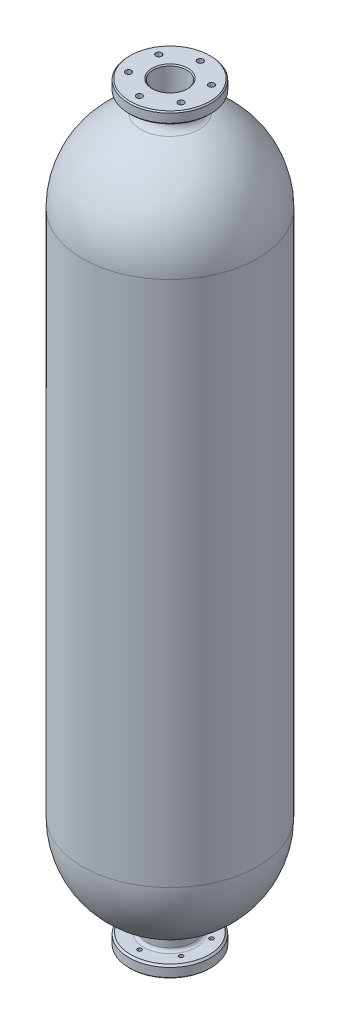
ISO-10303-21;
HEADER;
FILE_DESCRIPTION(('STEP AP214'),'2;1');
FILE_NAME('part.step','',(''),(''),'','','');
FILE_SCHEMA(('AUTOMOTIVE_DESIGN { 1 0 10303 214 1 1 1 1 }'));
ENDSEC;
DATA;
#1=APPLICATION_CONTEXT('core data for automotive mechanical design processes');
#2=APPLICATION_PROTOCOL_DEFINITION('international standard','automotive_design',2000,#1);
#3=PRODUCT_CONTEXT('',#1,'mechanical');
#4=PRODUCT('Part','Part','',(#3));
#5=PRODUCT_RELATED_PRODUCT_CATEGORY('part','',(#4));
#6=PRODUCT_DEFINITION_FORMATION('','',#4);
#7=PRODUCT_DEFINITION_CONTEXT('part definition',#1,'design');
#8=PRODUCT_DEFINITION('design','',#6,#7);
#9=PRODUCT_DEFINITION_SHAPE('','',#8);
#10=(LENGTH_UNIT() NAMED_UNIT(*) SI_UNIT(.MILLI.,.METRE.));
#11=(NAMED_UNIT(*) PLANE_ANGLE_UNIT() SI_UNIT($,.RADIAN.));
#12=(NAMED_UNIT(*) SI_UNIT($,.STERADIAN.) SOLID_ANGLE_UNIT());
#13=UNCERTAINTY_MEASURE_WITH_UNIT(LENGTH_MEASURE(1.E-05),#10,'distance_accuracy_value','');
#14=(GEOMETRIC_REPRESENTATION_CONTEXT(3) GLOBAL_UNCERTAINTY_ASSIGNED_CONTEXT((#13)) GLOBAL_UNIT_ASSIGNED_CONTEXT((#10,
#11,#12)) REPRESENTATION_CONTEXT('',''));
#15=CARTESIAN_POINT('',(0.,0.,0.));
#16=DIRECTION('',(0.,0.,1.));
#17=DIRECTION('',(1.,0.,0.));
#18=AXIS2_PLACEMENT_3D('',#15,#16,#17);
#19=CARTESIAN_POINT('',(0.,-450.5,0.));
#20=DIRECTION('',(0.,1.,0.));
#21=DIRECTION('',(-1.,0.,0.));
#22=AXIS2_PLACEMENT_3D('',#19,#20,#21);
#23=SPHERICAL_SURFACE('',#22,142.);
#24=CARTESIAN_POINT('',(0.,-589.571650833338,0.));
#25=DIRECTION('',(0.,1.,0.));
#26=DIRECTION('',(0.,0.,1.));
#27=AXIS2_PLACEMENT_3D('',#24,#25,#26);
#28=CIRCLE('',#27,28.6892999999999);
#29=CARTESIAN_POINT('',(0.,-589.571650833338,28.6892999999999));
#30=VERTEX_POINT('',#29);
#31=EDGE_CURVE('E535',#30,#30,#28,.T.);
#32=ORIENTED_EDGE('',*,*,#31,.F.);
#33=EDGE_LOOP('',(#32));
#34=FACE_BOUND('',#33,.T.);
#35=CARTESIAN_POINT('',(0.,-450.5,0.));
#36=DIRECTION('',(0.,1.,0.));
#37=DIRECTION('',(0.,0.,1.));
#38=AXIS2_PLACEMENT_3D('',#35,#36,#37);
#39=CIRCLE('',#38,142.);
#40=CARTESIAN_POINT('',(0.,-450.5,142.));
#41=VERTEX_POINT('',#40);
#42=EDGE_CURVE('E111',#41,#41,#39,.T.);
#43=ORIENTED_EDGE('',*,*,#42,.T.);
#44=EDGE_LOOP('',(#43));
#45=FACE_BOUND('',#44,.T.);
#46=ADVANCED_FACE('F53',(#34,#45),#23,.F.);
#47=CARTESIAN_POINT('',(0.,415.469849098758,0.));
#48=DIRECTION('',(0.,1.,0.));
#49=DIRECTION('',(0.,0.,1.));
#50=AXIS2_PLACEMENT_3D('',#47,#48,#49);
#51=CYLINDRICAL_SURFACE('',#50,142.);
#52=CARTESIAN_POINT('',(0.,450.5,0.));
#53=DIRECTION('',(0.,1.,0.));
#54=DIRECTION('',(0.,0.,1.));
#55=AXIS2_PLACEMENT_3D('',#52,#53,#54);
#56=CIRCLE('',#55,142.);
#57=CARTESIAN_POINT('',(0.,450.5,142.));
#58=VERTEX_POINT('',#57);
#59=EDGE_CURVE('E105',#58,#58,#56,.T.);
#60=ORIENTED_EDGE('',*,*,#59,.T.);
#61=EDGE_LOOP('',(#60));
#62=FACE_BOUND('',#61,.T.);
#63=ORIENTED_EDGE('',*,*,#42,.F.);
#64=EDGE_LOOP('',(#63));
#65=FACE_BOUND('',#64,.T.);
#66=ADVANCED_FACE('F330',(#62,#65),#51,.F.);
#67=CARTESIAN_POINT('',(0.,450.5,0.));
#68=DIRECTION('',(0.,1.,0.));
#69=DIRECTION('',(-1.,0.,0.));
#70=AXIS2_PLACEMENT_3D('',#67,#68,#69);
#71=SPHERICAL_SURFACE('',#70,142.);
#72=CARTESIAN_POINT('',(0.,589.571650833338,0.));
#73=DIRECTION('',(0.,-1.,0.));
#74=DIRECTION('',(0.,0.,-1.));
#75=AXIS2_PLACEMENT_3D('',#72,#73,#74);
#76=CIRCLE('',#75,28.6893);
#77=CARTESIAN_POINT('',(0.,589.571650833338,-28.6893));
#78=VERTEX_POINT('',#77);
#79=EDGE_CURVE('E257',#78,#78,#76,.T.);
#80=ORIENTED_EDGE('',*,*,#79,.F.);
#81=EDGE_LOOP('',(#80));
#82=FACE_BOUND('',#81,.T.);
#83=ORIENTED_EDGE('',*,*,#59,.F.);
#84=EDGE_LOOP('',(#83));
#85=FACE_BOUND('',#84,.T.);
#86=ADVANCED_FACE('F338',(#82,#85),#71,.F.);
#87=CARTESIAN_POINT('',(0.,642.5,0.));
#88=DIRECTION('',(0.,1.,0.));
#89=DIRECTION('',(0.,0.,1.));
#90=AXIS2_PLACEMENT_3D('',#87,#88,#89);
#91=CYLINDRICAL_SURFACE('',#90,28.6893);
#92=CARTESIAN_POINT('',(0.,640.6966,0.));
#93=DIRECTION('',(0.,1.,0.));
#94=DIRECTION('',(0.,0.,1.));
#95=AXIS2_PLACEMENT_3D('',#92,#93,#94);
#96=CIRCLE('',#95,28.6893);
#97=CARTESIAN_POINT('',(0.,640.6966,28.6893));
#98=VERTEX_POINT('',#97);
#99=EDGE_CURVE('E253',#98,#98,#96,.T.);
#100=ORIENTED_EDGE('',*,*,#99,.T.);
#101=EDGE_LOOP('',(#100));
#102=FACE_BOUND('',#101,.T.);
#103=ORIENTED_EDGE('',*,*,#79,.T.);
#104=EDGE_LOOP('',(#103));
#105=FACE_BOUND('',#104,.T.);
#106=ADVANCED_FACE('F464',(#102,#105),#91,.F.);
#107=CARTESIAN_POINT('',(0.,642.5,0.));
#108=DIRECTION('',(0.,1.,0.));
#109=DIRECTION('',(0.,0.,1.));
#110=AXIS2_PLACEMENT_3D('',#107,#108,#109);
#111=CONICAL_SURFACE('',#110,30.4927,0.785398163397452);
#112=ORIENTED_EDGE('',*,*,#99,.F.);
#113=EDGE_LOOP('',(#112));
#114=FACE_BOUND('',#113,.T.);
#115=CARTESIAN_POINT('',(0.,642.5,0.));
#116=DIRECTION('',(0.,1.,0.));
#117=DIRECTION('',(0.,0.,1.));
#118=AXIS2_PLACEMENT_3D('',#115,#116,#117);
#119=CIRCLE('',#118,30.4927);
#120=CARTESIAN_POINT('',(0.,642.5,30.4927));
#121=VERTEX_POINT('',#120);
#122=EDGE_CURVE('E75',#121,#121,#119,.T.);
#123=ORIENTED_EDGE('',*,*,#122,.T.);
#124=EDGE_LOOP('',(#123));
#125=FACE_BOUND('',#124,.T.);
#126=ADVANCED_FACE('F385',(#114,#125),#111,.F.);
#127=CARTESIAN_POINT('',(0.,450.5,0.));
#128=DIRECTION('',(0.,1.,0.));
#129=DIRECTION('',(-1.,0.,0.));
#130=AXIS2_PLACEMENT_3D('',#127,#128,#129);
#131=SPHERICAL_SURFACE('',#130,150.);
#132=CARTESIAN_POINT('',(0.,450.5,0.));
#133=DIRECTION('',(0.,1.,0.));
#134=DIRECTION('',(0.,0.,1.));
#135=AXIS2_PLACEMENT_3D('',#132,#133,#134);
#136=CIRCLE('',#135,150.);
#137=CARTESIAN_POINT('',(0.,450.5,150.));
#138=VERTEX_POINT('',#137);
#139=EDGE_CURVE('E11',#138,#138,#136,.T.);
#140=ORIENTED_EDGE('',*,*,#139,.T.);
#141=EDGE_LOOP('',(#140));
#142=FACE_BOUND('',#141,.T.);
#143=CARTESIAN_POINT('',(0.,591.92135623731,0.));
#144=DIRECTION('',(0.,1.,0.));
#145=DIRECTION('',(0.,0.,1.));
#146=AXIS2_PLACEMENT_3D('',#143,#144,#145);
#147=CIRCLE('',#146,50.);
#148=CARTESIAN_POINT('',(0.,591.92135623731,50.));
#149=VERTEX_POINT('',#148);
#150=EDGE_CURVE('E160',#149,#149,#147,.T.);
#151=ORIENTED_EDGE('',*,*,#150,.F.);
#152=EDGE_LOOP('',(#151));
#153=FACE_BOUND('',#152,.T.);
#154=ADVANCED_FACE('F55',(#142,#153),#131,.T.);
#155=CARTESIAN_POINT('',(0.,415.469849098758,0.));
#156=DIRECTION('',(0.,1.,0.));
#157=DIRECTION('',(0.,0.,1.));
#158=AXIS2_PLACEMENT_3D('',#155,#156,#157);
#159=CYLINDRICAL_SURFACE('',#158,150.);
#160=CARTESIAN_POINT('',(0.,-450.5,0.));
#161=DIRECTION('',(0.,1.,0.));
#162=DIRECTION('',(0.,0.,1.));
#163=AXIS2_PLACEMENT_3D('',#160,#161,#162);
#164=CIRCLE('',#163,150.);
#165=CARTESIAN_POINT('',(0.,-450.5,150.));
#166=VERTEX_POINT('',#165);
#167=EDGE_CURVE('E62',#166,#166,#164,.T.);
#168=ORIENTED_EDGE('',*,*,#167,.T.);
#169=EDGE_LOOP('',(#168));
#170=FACE_BOUND('',#169,.T.);
#171=ORIENTED_EDGE('',*,*,#139,.F.);
#172=EDGE_LOOP('',(#171));
#173=FACE_BOUND('',#172,.T.);
#174=ADVANCED_FACE('F378',(#170,#173),#159,.T.);
#175=CARTESIAN_POINT('',(0.,-450.5,0.));
#176=DIRECTION('',(0.,1.,0.));
#177=DIRECTION('',(-1.,0.,0.));
#178=AXIS2_PLACEMENT_3D('',#175,#176,#177);
#179=SPHERICAL_SURFACE('',#178,150.);
#180=CARTESIAN_POINT('',(0.,-591.92135623731,0.));
#181=DIRECTION('',(0.,1.,0.));
#182=DIRECTION('',(0.,0.,1.));
#183=AXIS2_PLACEMENT_3D('',#180,#181,#182);
#184=CIRCLE('',#183,50.);
#185=CARTESIAN_POINT('',(0.,-591.92135623731,50.));
#186=VERTEX_POINT('',#185);
#187=EDGE_CURVE('E149',#186,#186,#184,.T.);
#188=ORIENTED_EDGE('',*,*,#187,.T.);
#189=EDGE_LOOP('',(#188));
#190=FACE_BOUND('',#189,.T.);
#191=ORIENTED_EDGE('',*,*,#167,.F.);
#192=EDGE_LOOP('',(#191));
#193=FACE_BOUND('',#192,.T.);
#194=ADVANCED_FACE('F375',(#190,#193),#179,.T.);
#195=CARTESIAN_POINT('',(0.,-606.063491861041,0.));
#196=DIRECTION('',(0.,1.,0.));
#197=DIRECTION('',(0.,0.,1.));
#198=AXIS2_PLACEMENT_3D('',#195,#196,#197);
#199=TOROIDAL_SURFACE('',#198,55.,15.);
#200=CARTESIAN_POINT('',(0.,-606.06349186104,0.));
#201=DIRECTION('',(0.,1.,0.));
#202=DIRECTION('',(0.,0.,1.));
#203=AXIS2_PLACEMENT_3D('',#200,#201,#202);
#204=CIRCLE('',#203,40.);
#205=CARTESIAN_POINT('',(0.,-606.06349186104,40.));
#206=VERTEX_POINT('',#205);
#207=EDGE_CURVE('E145',#206,#206,#204,.T.);
#208=ORIENTED_EDGE('',*,*,#207,.T.);
#209=EDGE_LOOP('',(#208));
#210=FACE_BOUND('',#209,.T.);
#211=ORIENTED_EDGE('',*,*,#187,.F.);
#212=EDGE_LOOP('',(#211));
#213=FACE_BOUND('',#212,.T.);
#214=ADVANCED_FACE('F371',(#210,#213),#199,.F.);
#215=CARTESIAN_POINT('',(0.,415.469849098758,0.));
#216=DIRECTION('',(0.,1.,0.));
#217=DIRECTION('',(0.,0.,1.));
#218=AXIS2_PLACEMENT_3D('',#215,#216,#217);
#219=CYLINDRICAL_SURFACE('',#218,40.);
#220=CARTESIAN_POINT('',(0.,-617.5,0.));
#221=DIRECTION('',(0.,1.,0.));
#222=DIRECTION('',(0.,0.,1.));
#223=AXIS2_PLACEMENT_3D('',#220,#221,#222);
#224=CIRCLE('',#223,40.);
#225=CARTESIAN_POINT('',(0.,-617.5,40.));
#226=VERTEX_POINT('',#225);
#227=EDGE_CURVE('E141',#226,#226,#224,.T.);
#228=ORIENTED_EDGE('',*,*,#227,.T.);
#229=EDGE_LOOP('',(#228));
#230=FACE_BOUND('',#229,.T.);
#231=ORIENTED_EDGE('',*,*,#207,.F.);
#232=EDGE_LOOP('',(#231));
#233=FACE_BOUND('',#232,.T.);
#234=ADVANCED_FACE('F367',(#230,#233),#219,.T.);
#235=CARTESIAN_POINT('',(0.,-617.5,0.));
#236=DIRECTION('',(0.,1.,0.));
#237=DIRECTION('',(0.,0.,1.));
#238=AXIS2_PLACEMENT_3D('',#235,#236,#237);
#239=TOROIDAL_SURFACE('',#238,45.,5.00000000000006);
#240=CARTESIAN_POINT('',(0.,-622.5,0.));
#241=DIRECTION('',(0.,1.,0.));
#242=DIRECTION('',(0.,0.,1.));
#243=AXIS2_PLACEMENT_3D('',#240,#241,#242);
#244=CIRCLE('',#243,45.);
#245=CARTESIAN_POINT('',(0.,-622.5,45.));
#246=VERTEX_POINT('',#245);
#247=EDGE_CURVE('E137',#246,#246,#244,.T.);
#248=ORIENTED_EDGE('',*,*,#247,.T.);
#249=EDGE_LOOP('',(#248));
#250=FACE_BOUND('',#249,.T.);
#251=ORIENTED_EDGE('',*,*,#227,.F.);
#252=EDGE_LOOP('',(#251));
#253=FACE_BOUND('',#252,.T.);
#254=ADVANCED_FACE('F363',(#250,#253),#239,.F.);
#255=CARTESIAN_POINT('',(-67.,-622.5,0.));
#256=DIRECTION('',(0.,1.,0.));
#257=DIRECTION('',(0.,0.,1.));
#258=AXIS2_PLACEMENT_3D('',#255,#256,#257);
#259=PLANE('',#258);
#260=CARTESIAN_POINT('',(45.0333209967905,-622.5,-26.0000000000005));
#261=DIRECTION('',(0.,1.,0.));
#262=DIRECTION('',(0.,0.,1.));
#263=AXIS2_PLACEMENT_3D('',#260,#261,#262);
#264=CIRCLE('',#263,3.46083449176697);
#265=CARTESIAN_POINT('',(45.0333209967905,-622.5,-22.5391655082336));
#266=VERTEX_POINT('',#265);
#267=EDGE_CURVE('E57',#266,#266,#264,.T.);
#268=ORIENTED_EDGE('',*,*,#267,.F.);
#269=EDGE_LOOP('',(#268));
#270=FACE_BOUND('',#269,.T.);
#271=CARTESIAN_POINT('',(45.033320996791,-622.5,25.9999999999996));
#272=DIRECTION('',(0.,1.,0.));
#273=DIRECTION('',(0.,0.,1.));
#274=AXIS2_PLACEMENT_3D('',#271,#272,#273);
#275=CIRCLE('',#274,3.46083449176697);
#276=CARTESIAN_POINT('',(45.033320996791,-622.5,29.4608344917665));
#277=VERTEX_POINT('',#276);
#278=EDGE_CURVE('E209',#277,#277,#275,.T.);
#279=ORIENTED_EDGE('',*,*,#278,.F.);
#280=EDGE_LOOP('',(#279));
#281=FACE_BOUND('',#280,.T.);
#282=CARTESIAN_POINT('',(0.,-622.5,52.));
#283=DIRECTION('',(0.,1.,0.));
#284=DIRECTION('',(0.,0.,1.));
#285=AXIS2_PLACEMENT_3D('',#282,#283,#284);
#286=CIRCLE('',#285,3.46083449176697);
#287=CARTESIAN_POINT('',(0.,-622.5,55.460834491767));
#288=VERTEX_POINT('',#287);
#289=EDGE_CURVE('E204',#288,#288,#286,.T.);
#290=ORIENTED_EDGE('',*,*,#289,.F.);
#291=EDGE_LOOP('',(#290));
#292=FACE_BOUND('',#291,.T.);
#293=CARTESIAN_POINT('',(-45.0333209967907,-622.5,26.0000000000002));
#294=DIRECTION('',(0.,1.,0.));
#295=DIRECTION('',(0.,0.,1.));
#296=AXIS2_PLACEMENT_3D('',#293,#294,#295);
#297=CIRCLE('',#296,3.46083449176697);
#298=CARTESIAN_POINT('',(-45.0333209967907,-622.5,29.4608344917672));
#299=VERTEX_POINT('',#298);
#300=EDGE_CURVE('E198',#299,#299,#297,.T.);
#301=ORIENTED_EDGE('',*,*,#300,.F.);
#302=EDGE_LOOP('',(#301));
#303=FACE_BOUND('',#302,.T.);
#304=CARTESIAN_POINT('',(-45.0333209967909,-622.5,-25.9999999999999));
#305=DIRECTION('',(0.,1.,0.));
#306=DIRECTION('',(0.,0.,1.));
#307=AXIS2_PLACEMENT_3D('',#304,#305,#306);
#308=CIRCLE('',#307,3.46083449176697);
#309=CARTESIAN_POINT('',(-45.0333209967909,-622.5,-22.5391655082329));
#310=VERTEX_POINT('',#309);
#311=EDGE_CURVE('E192',#310,#310,#308,.T.);
#312=ORIENTED_EDGE('',*,*,#311,.F.);
#313=EDGE_LOOP('',(#312));
#314=FACE_BOUND('',#313,.T.);
#315=CARTESIAN_POINT('',(0.,-622.5,-52.));
#316=DIRECTION('',(0.,1.,0.));
#317=DIRECTION('',(0.,0.,1.));
#318=AXIS2_PLACEMENT_3D('',#315,#316,#317);
#319=CIRCLE('',#318,3.46083449176697);
#320=CARTESIAN_POINT('',(0.,-622.5,-48.539165508233));
#321=VERTEX_POINT('',#320);
#322=EDGE_CURVE('E187',#321,#321,#319,.T.);
#323=ORIENTED_EDGE('',*,*,#322,.F.);
#324=EDGE_LOOP('',(#323));
#325=FACE_BOUND('',#324,.T.);
#326=CARTESIAN_POINT('',(0.,-622.5,0.));
#327=DIRECTION('',(0.,1.,0.));
#328=DIRECTION('',(0.,0.,1.));
#329=AXIS2_PLACEMENT_3D('',#326,#327,#328);
#330=CIRCLE('',#329,67.);
#331=CARTESIAN_POINT('',(0.,-622.5,67.));
#332=VERTEX_POINT('',#331);
#333=EDGE_CURVE('E133',#332,#332,#330,.T.);
#334=ORIENTED_EDGE('',*,*,#333,.T.);
#335=EDGE_LOOP('',(#334));
#336=FACE_BOUND('',#335,.T.);
#337=ORIENTED_EDGE('',*,*,#247,.F.);
#338=EDGE_LOOP('',(#337));
#339=FACE_BOUND('',#338,.T.);
#340=ADVANCED_FACE('F359',(#270,#281,#292,#303,#314,#325,#336,#339),#259,.T.);
#341=CARTESIAN_POINT('',(0.,-622.5,0.));
#342=DIRECTION('',(0.,-1.,0.));
#343=DIRECTION('',(0.,0.,-1.));
#344=AXIS2_PLACEMENT_3D('',#341,#342,#343);
#345=CONICAL_SURFACE('',#344,67.,0.785398163397432);
#346=CARTESIAN_POINT('',(0.,-625.5,0.));
#347=DIRECTION('',(0.,1.,0.));
#348=DIRECTION('',(0.,0.,1.));
#349=AXIS2_PLACEMENT_3D('',#346,#347,#348);
#350=CIRCLE('',#349,70.);
#351=CARTESIAN_POINT('',(0.,-625.5,70.));
#352=VERTEX_POINT('',#351);
#353=EDGE_CURVE('E129',#352,#352,#350,.T.);
#354=ORIENTED_EDGE('',*,*,#353,.T.);
#355=EDGE_LOOP('',(#354));
#356=FACE_BOUND('',#355,.T.);
#357=ORIENTED_EDGE('',*,*,#333,.F.);
#358=EDGE_LOOP('',(#357));
#359=FACE_BOUND('',#358,.T.);
#360=ADVANCED_FACE('F355',(#356,#359),#345,.T.);
#361=CARTESIAN_POINT('',(0.,415.469849098758,0.));
#362=DIRECTION('',(0.,1.,0.));
#363=DIRECTION('',(0.,0.,1.));
#364=AXIS2_PLACEMENT_3D('',#361,#362,#363);
#365=CYLINDRICAL_SURFACE('',#364,70.);
#366=CARTESIAN_POINT('',(0.,-640.5,0.));
#367=DIRECTION('',(0.,1.,0.));
#368=DIRECTION('',(0.,0.,1.));
#369=AXIS2_PLACEMENT_3D('',#366,#367,#368);
#370=CIRCLE('',#369,70.);
#371=CARTESIAN_POINT('',(0.,-640.5,70.));
#372=VERTEX_POINT('',#371);
#373=EDGE_CURVE('E125',#372,#372,#370,.T.);
#374=ORIENTED_EDGE('',*,*,#373,.T.);
#375=EDGE_LOOP('',(#374));
#376=FACE_BOUND('',#375,.T.);
#377=ORIENTED_EDGE('',*,*,#353,.F.);
#378=EDGE_LOOP('',(#377));
#379=FACE_BOUND('',#378,.T.);
#380=ADVANCED_FACE('F351',(#376,#379),#365,.T.);
#381=CARTESIAN_POINT('',(0.,-640.5,0.));
#382=DIRECTION('',(0.,1.,0.));
#383=DIRECTION('',(0.,0.,1.));
#384=AXIS2_PLACEMENT_3D('',#381,#382,#383);
#385=CONICAL_SURFACE('',#384,70.,0.785398163397448);
#386=CARTESIAN_POINT('',(0.,-642.5,0.));
#387=DIRECTION('',(0.,1.,0.));
#388=DIRECTION('',(0.,0.,1.));
#389=AXIS2_PLACEMENT_3D('',#386,#387,#388);
#390=CIRCLE('',#389,68.);
#391=CARTESIAN_POINT('',(0.,-642.5,68.));
#392=VERTEX_POINT('',#391);
#393=EDGE_CURVE('E121',#392,#392,#390,.T.);
#394=ORIENTED_EDGE('',*,*,#393,.T.);
#395=EDGE_LOOP('',(#394));
#396=FACE_BOUND('',#395,.T.);
#397=ORIENTED_EDGE('',*,*,#373,.F.);
#398=EDGE_LOOP('',(#397));
#399=FACE_BOUND('',#398,.T.);
#400=ADVANCED_FACE('F347',(#396,#399),#385,.T.);
#401=CARTESIAN_POINT('',(0.,-642.5,0.));
#402=DIRECTION('',(0.,-1.,0.));
#403=DIRECTION('',(0.,0.,-1.));
#404=AXIS2_PLACEMENT_3D('',#401,#402,#403);
#405=PLANE('',#404);
#406=CARTESIAN_POINT('',(0.,-642.5,0.));
#407=DIRECTION('',(0.,-1.,0.));
#408=DIRECTION('',(0.,0.,-1.));
#409=AXIS2_PLACEMENT_3D('',#406,#407,#408);
#410=CIRCLE('',#409,30.4927);
#411=CARTESIAN_POINT('',(0.,-642.5,-30.4927));
#412=VERTEX_POINT('',#411);
#413=EDGE_CURVE('E531',#412,#412,#410,.T.);
#414=ORIENTED_EDGE('',*,*,#413,.F.);
#415=EDGE_LOOP('',(#414));
#416=FACE_BOUND('',#415,.T.);
#417=CARTESIAN_POINT('',(45.0333209967905,-642.5,-26.0000000000005));
#418=DIRECTION('',(0.,-1.,0.));
#419=DIRECTION('',(0.,0.,-1.));
#420=AXIS2_PLACEMENT_3D('',#417,#418,#419);
#421=CIRCLE('',#420,5.04189999999999);
#422=CARTESIAN_POINT('',(45.0333209967905,-642.5,-31.0419000000005));
#423=VERTEX_POINT('',#422);
#424=EDGE_CURVE('E541',#423,#423,#421,.T.);
#425=ORIENTED_EDGE('',*,*,#424,.F.);
#426=EDGE_LOOP('',(#425));
#427=FACE_BOUND('',#426,.T.);
#428=CARTESIAN_POINT('',(45.033320996791,-642.5,25.9999999999996));
#429=DIRECTION('',(0.,-1.,0.));
#430=DIRECTION('',(0.,0.,-1.));
#431=AXIS2_PLACEMENT_3D('',#428,#429,#430);
#432=CIRCLE('',#431,5.04189999999999);
#433=CARTESIAN_POINT('',(45.033320996791,-642.5,20.9580999999996));
#434=VERTEX_POINT('',#433);
#435=EDGE_CURVE('E221',#434,#434,#432,.T.);
#436=ORIENTED_EDGE('',*,*,#435,.F.);
#437=EDGE_LOOP('',(#436));
#438=FACE_BOUND('',#437,.T.);
#439=CARTESIAN_POINT('',(0.,-642.5,52.));
#440=DIRECTION('',(0.,-1.,0.));
#441=DIRECTION('',(0.,0.,-1.));
#442=AXIS2_PLACEMENT_3D('',#439,#440,#441);
#443=CIRCLE('',#442,5.0419);
#444=CARTESIAN_POINT('',(0.,-642.5,46.9581));
#445=VERTEX_POINT('',#444);
#446=EDGE_CURVE('E212',#445,#445,#443,.T.);
#447=ORIENTED_EDGE('',*,*,#446,.F.);
#448=EDGE_LOOP('',(#447));
#449=FACE_BOUND('',#448,.T.);
#450=CARTESIAN_POINT('',(-45.0333209967907,-642.5,26.0000000000002));
#451=DIRECTION('',(0.,-1.,0.));
#452=DIRECTION('',(0.,0.,-1.));
#453=AXIS2_PLACEMENT_3D('',#450,#451,#452);
#454=CIRCLE('',#453,5.0419);
#455=CARTESIAN_POINT('',(-45.0333209967907,-642.5,20.9581000000002));
#456=VERTEX_POINT('',#455);
#457=EDGE_CURVE('E207',#456,#456,#454,.T.);
#458=ORIENTED_EDGE('',*,*,#457,.F.);
#459=EDGE_LOOP('',(#458));
#460=FACE_BOUND('',#459,.T.);
#461=CARTESIAN_POINT('',(-45.0333209967909,-642.5,-25.9999999999999));
#462=DIRECTION('',(0.,-1.,0.));
#463=DIRECTION('',(0.,0.,-1.));
#464=AXIS2_PLACEMENT_3D('',#461,#462,#463);
#465=CIRCLE('',#464,5.04189999999999);
#466=CARTESIAN_POINT('',(-45.0333209967909,-642.5,-31.0418999999999));
#467=VERTEX_POINT('',#466);
#468=EDGE_CURVE('E202',#467,#467,#465,.T.);
#469=ORIENTED_EDGE('',*,*,#468,.F.);
#470=EDGE_LOOP('',(#469));
#471=FACE_BOUND('',#470,.T.);
#472=CARTESIAN_POINT('',(0.,-642.5,-52.));
#473=DIRECTION('',(0.,-1.,0.));
#474=DIRECTION('',(0.,0.,-1.));
#475=AXIS2_PLACEMENT_3D('',#472,#473,#474);
#476=CIRCLE('',#475,5.0419);
#477=CARTESIAN_POINT('',(0.,-642.5,-57.0419));
#478=VERTEX_POINT('',#477);
#479=EDGE_CURVE('E196',#478,#478,#476,.T.);
#480=ORIENTED_EDGE('',*,*,#479,.F.);
#481=EDGE_LOOP('',(#480));
#482=FACE_BOUND('',#481,.T.);
#483=ORIENTED_EDGE('',*,*,#393,.F.);
#484=EDGE_LOOP('',(#483));
#485=FACE_BOUND('',#484,.T.);
#486=ADVANCED_FACE('F70',(#416,#427,#438,#449,#460,#471,#482,#485),#405,.T.);
#487=CARTESIAN_POINT('',(-40.,642.5,0.));
#488=DIRECTION('',(0.,1.,0.));
#489=DIRECTION('',(0.,0.,1.));
#490=AXIS2_PLACEMENT_3D('',#487,#488,#489);
#491=PLANE('',#490);
#492=CARTESIAN_POINT('',(0.,644.303460289957,59.716398180906));
#493=VERTEX_POINT('',#492);
#494=VERTEX_LOOP('',#493);
#495=FACE_BOUND('',#494,.T.);
#496=ORIENTED_EDGE('',*,*,#122,.F.);
#497=EDGE_LOOP('',(#496));
#498=FACE_BOUND('',#497,.T.);
#499=CARTESIAN_POINT('',(45.0333209967905,642.5,-26.0000000000005));
#500=DIRECTION('',(0.,1.,0.));
#501=DIRECTION('',(0.,0.,1.));
#502=AXIS2_PLACEMENT_3D('',#499,#500,#501);
#503=CIRCLE('',#502,5.04189999999999);
#504=CARTESIAN_POINT('',(45.0333209967905,642.5,-20.9581000000005));
#505=VERTEX_POINT('',#504);
#506=EDGE_CURVE('E79',#505,#505,#503,.T.);
#507=ORIENTED_EDGE('',*,*,#506,.F.);
#508=EDGE_LOOP('',(#507));
#509=FACE_BOUND('',#508,.T.);
#510=CARTESIAN_POINT('',(45.033320996791,642.5,25.9999999999996));
#511=DIRECTION('',(0.,1.,0.));
#512=DIRECTION('',(0.,0.,1.));
#513=AXIS2_PLACEMENT_3D('',#510,#511,#512);
#514=CIRCLE('',#513,5.04189999999999);
#515=CARTESIAN_POINT('',(45.033320996791,642.5,31.0418999999996));
#516=VERTEX_POINT('',#515);
#517=EDGE_CURVE('E83',#516,#516,#514,.T.);
#518=ORIENTED_EDGE('',*,*,#517,.F.);
#519=EDGE_LOOP('',(#518));
#520=FACE_BOUND('',#519,.T.);
#521=CARTESIAN_POINT('',(0.,642.5,52.));
#522=DIRECTION('',(0.,1.,0.));
#523=DIRECTION('',(0.,0.,1.));
#524=AXIS2_PLACEMENT_3D('',#521,#522,#523);
#525=CIRCLE('',#524,5.0419);
#526=CARTESIAN_POINT('',(0.,642.5,57.0419));
#527=VERTEX_POINT('',#526);
#528=EDGE_CURVE('E87',#527,#527,#525,.T.);
#529=ORIENTED_EDGE('',*,*,#528,.F.);
#530=EDGE_LOOP('',(#529));
#531=FACE_BOUND('',#530,.T.);
#532=CARTESIAN_POINT('',(-45.0333209967907,642.5,26.0000000000002));
#533=DIRECTION('',(0.,1.,0.));
#534=DIRECTION('',(0.,0.,1.));
#535=AXIS2_PLACEMENT_3D('',#532,#533,#534);
#536=CIRCLE('',#535,5.0419);
#537=CARTESIAN_POINT('',(-45.0333209967907,642.5,31.0419000000002));
#538=VERTEX_POINT('',#537);
#539=EDGE_CURVE('E91',#538,#538,#536,.T.);
#540=ORIENTED_EDGE('',*,*,#539,.F.);
#541=EDGE_LOOP('',(#540));
#542=FACE_BOUND('',#541,.T.);
#543=CARTESIAN_POINT('',(-45.0333209967909,642.5,-25.9999999999999));
#544=DIRECTION('',(0.,1.,0.));
#545=DIRECTION('',(0.,0.,1.));
#546=AXIS2_PLACEMENT_3D('',#543,#544,#545);
#547=CIRCLE('',#546,5.04189999999999);
#548=CARTESIAN_POINT('',(-45.0333209967909,642.5,-20.9580999999999));
#549=VERTEX_POINT('',#548);
#550=EDGE_CURVE('E95',#549,#549,#547,.T.);
#551=ORIENTED_EDGE('',*,*,#550,.F.);
#552=EDGE_LOOP('',(#551));
#553=FACE_BOUND('',#552,.T.);
#554=CARTESIAN_POINT('',(0.,642.5,-52.));
#555=DIRECTION('',(0.,1.,0.));
#556=DIRECTION('',(0.,0.,1.));
#557=AXIS2_PLACEMENT_3D('',#554,#555,#556);
#558=CIRCLE('',#557,5.0419);
#559=CARTESIAN_POINT('',(0.,642.5,-46.9581));
#560=VERTEX_POINT('',#559);
#561=EDGE_CURVE('E99',#560,#560,#558,.T.);
#562=ORIENTED_EDGE('',*,*,#561,.F.);
#563=EDGE_LOOP('',(#562));
#564=FACE_BOUND('',#563,.T.);
#565=CARTESIAN_POINT('',(0.,642.5,0.));
#566=DIRECTION('',(0.,1.,0.));
#567=DIRECTION('',(0.,0.,1.));
#568=AXIS2_PLACEMENT_3D('',#565,#566,#567);
#569=CIRCLE('',#568,68.);
#570=CARTESIAN_POINT('',(0.,642.5,68.));
#571=VERTEX_POINT('',#570);
#572=EDGE_CURVE('E102',#571,#571,#569,.T.);
#573=ORIENTED_EDGE('',*,*,#572,.T.);
#574=EDGE_LOOP('',(#573));
#575=FACE_BOUND('',#574,.T.);
#576=ADVANCED_FACE('F66',(#495,#498,#509,#520,#531,#542,#553,#564,#575),#491,.T.);
#577=CARTESIAN_POINT('',(0.,642.5,0.));
#578=DIRECTION('',(0.,-1.,0.));
#579=DIRECTION('',(0.,0.,-1.));
#580=AXIS2_PLACEMENT_3D('',#577,#578,#579);
#581=CONICAL_SURFACE('',#580,68.,0.785398163397448);
#582=CARTESIAN_POINT('',(0.,640.5,0.));
#583=DIRECTION('',(0.,1.,0.));
#584=DIRECTION('',(0.,0.,1.));
#585=AXIS2_PLACEMENT_3D('',#582,#583,#584);
#586=CIRCLE('',#585,70.);
#587=CARTESIAN_POINT('',(0.,640.5,70.));
#588=VERTEX_POINT('',#587);
#589=EDGE_CURVE('E106',#588,#588,#586,.T.);
#590=ORIENTED_EDGE('',*,*,#589,.T.);
#591=EDGE_LOOP('',(#590));
#592=FACE_BOUND('',#591,.T.);
#593=ORIENTED_EDGE('',*,*,#572,.F.);
#594=EDGE_LOOP('',(#593));
#595=FACE_BOUND('',#594,.T.);
#596=ADVANCED_FACE('F69',(#592,#595),#581,.T.);
#597=CARTESIAN_POINT('',(0.,415.469849098758,0.));
#598=DIRECTION('',(0.,1.,0.));
#599=DIRECTION('',(0.,0.,1.));
#600=AXIS2_PLACEMENT_3D('',#597,#598,#599);
#601=CYLINDRICAL_SURFACE('',#600,70.);
#602=CARTESIAN_POINT('',(0.,625.5,0.));
#603=DIRECTION('',(0.,1.,0.));
#604=DIRECTION('',(0.,0.,1.));
#605=AXIS2_PLACEMENT_3D('',#602,#603,#604);
#606=CIRCLE('',#605,70.);
#607=CARTESIAN_POINT('',(0.,625.5,70.));
#608=VERTEX_POINT('',#607);
#609=EDGE_CURVE('E114',#608,#608,#606,.T.);
#610=ORIENTED_EDGE('',*,*,#609,.T.);
#611=EDGE_LOOP('',(#610));
#612=FACE_BOUND('',#611,.T.);
#613=ORIENTED_EDGE('',*,*,#589,.F.);
#614=EDGE_LOOP('',(#613));
#615=FACE_BOUND('',#614,.T.);
#616=ADVANCED_FACE('F313',(#612,#615),#601,.T.);
#617=CARTESIAN_POINT('',(0.,625.5,0.));
#618=DIRECTION('',(0.,1.,0.));
#619=DIRECTION('',(0.,0.,1.));
#620=AXIS2_PLACEMENT_3D('',#617,#618,#619);
#621=CONICAL_SURFACE('',#620,70.,0.785398163397451);
#622=CARTESIAN_POINT('',(0.,622.5,0.));
#623=DIRECTION('',(0.,1.,0.));
#624=DIRECTION('',(0.,0.,1.));
#625=AXIS2_PLACEMENT_3D('',#622,#623,#624);
#626=CIRCLE('',#625,67.);
#627=CARTESIAN_POINT('',(0.,622.5,67.));
#628=VERTEX_POINT('',#627);
#629=EDGE_CURVE('E306',#628,#628,#626,.T.);
#630=ORIENTED_EDGE('',*,*,#629,.T.);
#631=EDGE_LOOP('',(#630));
#632=FACE_BOUND('',#631,.T.);
#633=ORIENTED_EDGE('',*,*,#609,.F.);
#634=EDGE_LOOP('',(#633));
#635=FACE_BOUND('',#634,.T.);
#636=ADVANCED_FACE('F316',(#632,#635),#621,.T.);
#637=CARTESIAN_POINT('',(-67.,622.5,0.));
#638=DIRECTION('',(0.,-1.,0.));
#639=DIRECTION('',(0.,0.,-1.));
#640=AXIS2_PLACEMENT_3D('',#637,#638,#639);
#641=PLANE('',#640);
#642=CARTESIAN_POINT('',(45.0333209967905,622.5,-26.0000000000005));
#643=DIRECTION('',(0.,-1.,0.));
#644=DIRECTION('',(0.,0.,-1.));
#645=AXIS2_PLACEMENT_3D('',#642,#643,#644);
#646=CIRCLE('',#645,3.46083449176716);
#647=CARTESIAN_POINT('',(45.0333209967905,622.5,-29.4608344917677));
#648=VERTEX_POINT('',#647);
#649=EDGE_CURVE('E182',#648,#648,#646,.T.);
#650=ORIENTED_EDGE('',*,*,#649,.F.);
#651=EDGE_LOOP('',(#650));
#652=FACE_BOUND('',#651,.T.);
#653=CARTESIAN_POINT('',(45.033320996791,622.5,25.9999999999996));
#654=DIRECTION('',(0.,-1.,0.));
#655=DIRECTION('',(0.,0.,-1.));
#656=AXIS2_PLACEMENT_3D('',#653,#654,#655);
#657=CIRCLE('',#656,3.46083449176716);
#658=CARTESIAN_POINT('',(45.033320996791,622.5,22.5391655082324));
#659=VERTEX_POINT('',#658);
#660=EDGE_CURVE('E177',#659,#659,#657,.T.);
#661=ORIENTED_EDGE('',*,*,#660,.F.);
#662=EDGE_LOOP('',(#661));
#663=FACE_BOUND('',#662,.T.);
#664=CARTESIAN_POINT('',(0.,622.5,52.));
#665=DIRECTION('',(0.,-1.,0.));
#666=DIRECTION('',(0.,0.,-1.));
#667=AXIS2_PLACEMENT_3D('',#664,#665,#666);
#668=CIRCLE('',#667,3.46083449176716);
#669=CARTESIAN_POINT('',(0.,622.5,48.5391655082328));
#670=VERTEX_POINT('',#669);
#671=EDGE_CURVE('E172',#670,#670,#668,.T.);
#672=ORIENTED_EDGE('',*,*,#671,.F.);
#673=EDGE_LOOP('',(#672));
#674=FACE_BOUND('',#673,.T.);
#675=CARTESIAN_POINT('',(-45.0333209967907,622.5,26.0000000000002));
#676=DIRECTION('',(0.,-1.,0.));
#677=DIRECTION('',(0.,0.,-1.));
#678=AXIS2_PLACEMENT_3D('',#675,#676,#677);
#679=CIRCLE('',#678,3.46083449176716);
#680=CARTESIAN_POINT('',(-45.0333209967907,622.5,22.5391655082331));
#681=VERTEX_POINT('',#680);
#682=EDGE_CURVE('E167',#681,#681,#679,.T.);
#683=ORIENTED_EDGE('',*,*,#682,.F.);
#684=EDGE_LOOP('',(#683));
#685=FACE_BOUND('',#684,.T.);
#686=CARTESIAN_POINT('',(-45.0333209967909,622.5,-25.9999999999999));
#687=DIRECTION('',(0.,-1.,0.));
#688=DIRECTION('',(0.,0.,-1.));
#689=AXIS2_PLACEMENT_3D('',#686,#687,#688);
#690=CIRCLE('',#689,3.46083449176716);
#691=CARTESIAN_POINT('',(-45.0333209967909,622.5,-29.460834491767));
#692=VERTEX_POINT('',#691);
#693=EDGE_CURVE('E162',#692,#692,#690,.T.);
#694=ORIENTED_EDGE('',*,*,#693,.F.);
#695=EDGE_LOOP('',(#694));
#696=FACE_BOUND('',#695,.T.);
#697=CARTESIAN_POINT('',(0.,622.5,-52.));
#698=DIRECTION('',(0.,-1.,0.));
#699=DIRECTION('',(0.,0.,-1.));
#700=AXIS2_PLACEMENT_3D('',#697,#698,#699);
#701=CIRCLE('',#700,3.46083449176716);
#702=CARTESIAN_POINT('',(0.,622.5,-55.4608344917672));
#703=VERTEX_POINT('',#702);
#704=EDGE_CURVE('E156',#703,#703,#701,.T.);
#705=ORIENTED_EDGE('',*,*,#704,.F.);
#706=EDGE_LOOP('',(#705));
#707=FACE_BOUND('',#706,.T.);
#708=CARTESIAN_POINT('',(0.,622.5,0.));
#709=DIRECTION('',(0.,1.,0.));
#710=DIRECTION('',(0.,0.,1.));
#711=AXIS2_PLACEMENT_3D('',#708,#709,#710);
#712=CIRCLE('',#711,45.);
#713=CARTESIAN_POINT('',(0.,622.5,45.));
#714=VERTEX_POINT('',#713);
#715=EDGE_CURVE('E302',#714,#714,#712,.T.);
#716=ORIENTED_EDGE('',*,*,#715,.T.);
#717=EDGE_LOOP('',(#716));
#718=FACE_BOUND('',#717,.T.);
#719=ORIENTED_EDGE('',*,*,#629,.F.);
#720=EDGE_LOOP('',(#719));
#721=FACE_BOUND('',#720,.T.);
#722=ADVANCED_FACE('F318',(#652,#663,#674,#685,#696,#707,#718,#721),#641,.T.);
#723=CARTESIAN_POINT('',(0.,617.5,0.));
#724=DIRECTION('',(0.,1.,0.));
#725=DIRECTION('',(0.,0.,1.));
#726=AXIS2_PLACEMENT_3D('',#723,#724,#725);
#727=TOROIDAL_SURFACE('',#726,45.,5.00000000000006);
#728=CARTESIAN_POINT('',(0.,617.5,0.));
#729=DIRECTION('',(0.,1.,0.));
#730=DIRECTION('',(0.,0.,1.));
#731=AXIS2_PLACEMENT_3D('',#728,#729,#730);
#732=CIRCLE('',#731,40.);
#733=CARTESIAN_POINT('',(0.,617.5,40.));
#734=VERTEX_POINT('',#733);
#735=EDGE_CURVE('E298',#734,#734,#732,.T.);
#736=ORIENTED_EDGE('',*,*,#735,.T.);
#737=EDGE_LOOP('',(#736));
#738=FACE_BOUND('',#737,.T.);
#739=ORIENTED_EDGE('',*,*,#715,.F.);
#740=EDGE_LOOP('',(#739));
#741=FACE_BOUND('',#740,.T.);
#742=ADVANCED_FACE('F325',(#738,#741),#727,.F.);
#743=CARTESIAN_POINT('',(0.,415.469849098758,0.));
#744=DIRECTION('',(0.,1.,0.));
#745=DIRECTION('',(0.,0.,1.));
#746=AXIS2_PLACEMENT_3D('',#743,#744,#745);
#747=CYLINDRICAL_SURFACE('',#746,40.);
#748=CARTESIAN_POINT('',(0.,606.063491861041,0.));
#749=DIRECTION('',(0.,1.,0.));
#750=DIRECTION('',(0.,0.,1.));
#751=AXIS2_PLACEMENT_3D('',#748,#749,#750);
#752=CIRCLE('',#751,40.);
#753=CARTESIAN_POINT('',(0.,606.063491861041,40.));
#754=VERTEX_POINT('',#753);
#755=EDGE_CURVE('E294',#754,#754,#752,.T.);
#756=ORIENTED_EDGE('',*,*,#755,.T.);
#757=EDGE_LOOP('',(#756));
#758=FACE_BOUND('',#757,.T.);
#759=ORIENTED_EDGE('',*,*,#735,.F.);
#760=EDGE_LOOP('',(#759));
#761=FACE_BOUND('',#760,.T.);
#762=ADVANCED_FACE('F397',(#758,#761),#747,.T.);
#763=CARTESIAN_POINT('',(0.,606.063491861041,0.));
#764=DIRECTION('',(0.,1.,0.));
#765=DIRECTION('',(0.,0.,1.));
#766=AXIS2_PLACEMENT_3D('',#763,#764,#765);
#767=TOROIDAL_SURFACE('',#766,55.,15.);
#768=ORIENTED_EDGE('',*,*,#150,.T.);
#769=EDGE_LOOP('',(#768));
#770=FACE_BOUND('',#769,.T.);
#771=ORIENTED_EDGE('',*,*,#755,.F.);
#772=EDGE_LOOP('',(#771));
#773=FACE_BOUND('',#772,.T.);
#774=ADVANCED_FACE('F393',(#770,#773),#767,.F.);
#775=CARTESIAN_POINT('',(0.,623.45,-52.));
#776=DIRECTION('',(0.,1.,0.));
#777=DIRECTION('',(0.,0.,1.));
#778=AXIS2_PLACEMENT_3D('',#775,#776,#777);
#779=CONICAL_SURFACE('',#778,5.0419,1.02974425867666);
#780=ORIENTED_EDGE('',*,*,#704,.T.);
#781=EDGE_LOOP('',(#780));
#782=FACE_BOUND('',#781,.T.);
#783=CARTESIAN_POINT('',(0.,623.45,-52.));
#784=DIRECTION('',(0.,1.,0.));
#785=DIRECTION('',(0.,0.,1.));
#786=AXIS2_PLACEMENT_3D('',#783,#784,#785);
#787=CIRCLE('',#786,5.0419);
#788=CARTESIAN_POINT('',(0.,623.45,-46.9581));
#789=VERTEX_POINT('',#788);
#790=EDGE_CURVE('E161',#789,#789,#787,.T.);
#791=ORIENTED_EDGE('',*,*,#790,.T.);
#792=EDGE_LOOP('',(#791));
#793=FACE_BOUND('',#792,.T.);
#794=ADVANCED_FACE('F396',(#782,#793),#779,.F.);
#795=CARTESIAN_POINT('',(0.,642.5,-52.));
#796=DIRECTION('',(0.,1.,0.));
#797=DIRECTION('',(0.,0.,1.));
#798=AXIS2_PLACEMENT_3D('',#795,#796,#797);
#799=CYLINDRICAL_SURFACE('',#798,5.0419);
#800=ORIENTED_EDGE('',*,*,#790,.F.);
#801=EDGE_LOOP('',(#800));
#802=FACE_BOUND('',#801,.T.);
#803=ORIENTED_EDGE('',*,*,#561,.T.);
#804=EDGE_LOOP('',(#803));
#805=FACE_BOUND('',#804,.T.);
#806=ADVANCED_FACE('F418',(#802,#805),#799,.F.);
#807=CARTESIAN_POINT('',(-45.0333209967909,623.45,-25.9999999999999));
#808=DIRECTION('',(0.,1.,0.));
#809=DIRECTION('',(0.,0.,1.));
#810=AXIS2_PLACEMENT_3D('',#807,#808,#809);
#811=CONICAL_SURFACE('',#810,5.04189999999999,1.02974425867666);
#812=ORIENTED_EDGE('',*,*,#693,.T.);
#813=EDGE_LOOP('',(#812));
#814=FACE_BOUND('',#813,.T.);
#815=CARTESIAN_POINT('',(-45.0333209967909,623.45,-25.9999999999999));
#816=DIRECTION('',(0.,1.,0.));
#817=DIRECTION('',(0.,0.,1.));
#818=AXIS2_PLACEMENT_3D('',#815,#816,#817);
#819=CIRCLE('',#818,5.04189999999999);
#820=CARTESIAN_POINT('',(-45.0333209967909,623.45,-20.9580999999999));
#821=VERTEX_POINT('',#820);
#822=EDGE_CURVE('E166',#821,#821,#819,.T.);
#823=ORIENTED_EDGE('',*,*,#822,.T.);
#824=EDGE_LOOP('',(#823));
#825=FACE_BOUND('',#824,.T.);
#826=ADVANCED_FACE('F422',(#814,#825),#811,.F.);
#827=CARTESIAN_POINT('',(-45.0333209967909,642.5,-25.9999999999999));
#828=DIRECTION('',(0.,1.,0.));
#829=DIRECTION('',(0.,0.,1.));
#830=AXIS2_PLACEMENT_3D('',#827,#828,#829);
#831=CYLINDRICAL_SURFACE('',#830,5.04189999999999);
#832=ORIENTED_EDGE('',*,*,#822,.F.);
#833=EDGE_LOOP('',(#832));
#834=FACE_BOUND('',#833,.T.);
#835=ORIENTED_EDGE('',*,*,#550,.T.);
#836=EDGE_LOOP('',(#835));
#837=FACE_BOUND('',#836,.T.);
#838=ADVANCED_FACE('F426',(#834,#837),#831,.F.);
#839=CARTESIAN_POINT('',(-45.0333209967907,623.45,26.0000000000002));
#840=DIRECTION('',(0.,1.,0.));
#841=DIRECTION('',(0.,0.,1.));
#842=AXIS2_PLACEMENT_3D('',#839,#840,#841);
#843=CONICAL_SURFACE('',#842,5.04189999999999,1.02974425867666);
#844=ORIENTED_EDGE('',*,*,#682,.T.);
#845=EDGE_LOOP('',(#844));
#846=FACE_BOUND('',#845,.T.);
#847=CARTESIAN_POINT('',(-45.0333209967907,623.45,26.0000000000002));
#848=DIRECTION('',(0.,1.,0.));
#849=DIRECTION('',(0.,0.,1.));
#850=AXIS2_PLACEMENT_3D('',#847,#848,#849);
#851=CIRCLE('',#850,5.04189999999999);
#852=CARTESIAN_POINT('',(-45.0333209967907,623.45,31.0419000000002));
#853=VERTEX_POINT('',#852);
#854=EDGE_CURVE('E171',#853,#853,#851,.T.);
#855=ORIENTED_EDGE('',*,*,#854,.T.);
#856=EDGE_LOOP('',(#855));
#857=FACE_BOUND('',#856,.T.);
#858=ADVANCED_FACE('F430',(#846,#857),#843,.F.);
#859=CARTESIAN_POINT('',(-45.0333209967907,642.5,26.0000000000002));
#860=DIRECTION('',(0.,1.,0.));
#861=DIRECTION('',(0.,0.,1.));
#862=AXIS2_PLACEMENT_3D('',#859,#860,#861);
#863=CYLINDRICAL_SURFACE('',#862,5.0419);
#864=ORIENTED_EDGE('',*,*,#854,.F.);
#865=EDGE_LOOP('',(#864));
#866=FACE_BOUND('',#865,.T.);
#867=ORIENTED_EDGE('',*,*,#539,.T.);
#868=EDGE_LOOP('',(#867));
#869=FACE_BOUND('',#868,.T.);
#870=ADVANCED_FACE('F434',(#866,#869),#863,.F.);
#871=CARTESIAN_POINT('',(0.,623.45,52.));
#872=DIRECTION('',(0.,1.,0.));
#873=DIRECTION('',(0.,0.,1.));
#874=AXIS2_PLACEMENT_3D('',#871,#872,#873);
#875=CONICAL_SURFACE('',#874,5.0419,1.02974425867666);
#876=ORIENTED_EDGE('',*,*,#671,.T.);
#877=EDGE_LOOP('',(#876));
#878=FACE_BOUND('',#877,.T.);
#879=CARTESIAN_POINT('',(0.,623.45,52.));
#880=DIRECTION('',(0.,1.,0.));
#881=DIRECTION('',(0.,0.,1.));
#882=AXIS2_PLACEMENT_3D('',#879,#880,#881);
#883=CIRCLE('',#882,5.0419);
#884=CARTESIAN_POINT('',(0.,623.45,57.0419));
#885=VERTEX_POINT('',#884);
#886=EDGE_CURVE('E176',#885,#885,#883,.T.);
#887=ORIENTED_EDGE('',*,*,#886,.T.);
#888=EDGE_LOOP('',(#887));
#889=FACE_BOUND('',#888,.T.);
#890=ADVANCED_FACE('F438',(#878,#889),#875,.F.);
#891=CARTESIAN_POINT('',(0.,642.5,52.));
#892=DIRECTION('',(0.,1.,0.));
#893=DIRECTION('',(0.,0.,1.));
#894=AXIS2_PLACEMENT_3D('',#891,#892,#893);
#895=CYLINDRICAL_SURFACE('',#894,5.0419);
#896=ORIENTED_EDGE('',*,*,#886,.F.);
#897=EDGE_LOOP('',(#896));
#898=FACE_BOUND('',#897,.T.);
#899=ORIENTED_EDGE('',*,*,#528,.T.);
#900=EDGE_LOOP('',(#899));
#901=FACE_BOUND('',#900,.T.);
#902=ADVANCED_FACE('F442',(#898,#901),#895,.F.);
#903=CARTESIAN_POINT('',(45.033320996791,623.45,25.9999999999996));
#904=DIRECTION('',(0.,1.,0.));
#905=DIRECTION('',(0.,0.,1.));
#906=AXIS2_PLACEMENT_3D('',#903,#904,#905);
#907=CONICAL_SURFACE('',#906,5.04189999999999,1.02974425867666);
#908=ORIENTED_EDGE('',*,*,#660,.T.);
#909=EDGE_LOOP('',(#908));
#910=FACE_BOUND('',#909,.T.);
#911=CARTESIAN_POINT('',(45.033320996791,623.45,25.9999999999996));
#912=DIRECTION('',(0.,1.,0.));
#913=DIRECTION('',(0.,0.,1.));
#914=AXIS2_PLACEMENT_3D('',#911,#912,#913);
#915=CIRCLE('',#914,5.04189999999999);
#916=CARTESIAN_POINT('',(45.033320996791,623.45,31.0418999999996));
#917=VERTEX_POINT('',#916);
#918=EDGE_CURVE('E181',#917,#917,#915,.T.);
#919=ORIENTED_EDGE('',*,*,#918,.T.);
#920=EDGE_LOOP('',(#919));
#921=FACE_BOUND('',#920,.T.);
#922=ADVANCED_FACE('F446',(#910,#921),#907,.F.);
#923=CARTESIAN_POINT('',(45.033320996791,642.5,25.9999999999996));
#924=DIRECTION('',(0.,1.,0.));
#925=DIRECTION('',(0.,0.,1.));
#926=AXIS2_PLACEMENT_3D('',#923,#924,#925);
#927=CYLINDRICAL_SURFACE('',#926,5.04189999999999);
#928=ORIENTED_EDGE('',*,*,#918,.F.);
#929=EDGE_LOOP('',(#928));
#930=FACE_BOUND('',#929,.T.);
#931=ORIENTED_EDGE('',*,*,#517,.T.);
#932=EDGE_LOOP('',(#931));
#933=FACE_BOUND('',#932,.T.);
#934=ADVANCED_FACE('F450',(#930,#933),#927,.F.);
#935=CARTESIAN_POINT('',(45.0333209967905,623.45,-26.0000000000005));
#936=DIRECTION('',(0.,1.,0.));
#937=DIRECTION('',(0.,0.,1.));
#938=AXIS2_PLACEMENT_3D('',#935,#936,#937);
#939=CONICAL_SURFACE('',#938,5.04189999999999,1.02974425867666);
#940=ORIENTED_EDGE('',*,*,#649,.T.);
#941=EDGE_LOOP('',(#940));
#942=FACE_BOUND('',#941,.T.);
#943=CARTESIAN_POINT('',(45.0333209967905,623.45,-26.0000000000005));
#944=DIRECTION('',(0.,1.,0.));
#945=DIRECTION('',(0.,0.,1.));
#946=AXIS2_PLACEMENT_3D('',#943,#944,#945);
#947=CIRCLE('',#946,5.04189999999999);
#948=CARTESIAN_POINT('',(45.0333209967905,623.45,-20.9581000000005));
#949=VERTEX_POINT('',#948);
#950=EDGE_CURVE('E186',#949,#949,#947,.T.);
#951=ORIENTED_EDGE('',*,*,#950,.T.);
#952=EDGE_LOOP('',(#951));
#953=FACE_BOUND('',#952,.T.);
#954=ADVANCED_FACE('F454',(#942,#953),#939,.F.);
#955=CARTESIAN_POINT('',(45.0333209967905,642.5,-26.0000000000005));
#956=DIRECTION('',(0.,1.,0.));
#957=DIRECTION('',(0.,0.,1.));
#958=AXIS2_PLACEMENT_3D('',#955,#956,#957);
#959=CYLINDRICAL_SURFACE('',#958,5.04189999999999);
#960=ORIENTED_EDGE('',*,*,#950,.F.);
#961=EDGE_LOOP('',(#960));
#962=FACE_BOUND('',#961,.T.);
#963=ORIENTED_EDGE('',*,*,#506,.T.);
#964=EDGE_LOOP('',(#963));
#965=FACE_BOUND('',#964,.T.);
#966=ADVANCED_FACE('F458',(#962,#965),#959,.F.);
#967=CARTESIAN_POINT('',(0.,-623.45,-52.));
#968=DIRECTION('',(0.,-1.,0.));
#969=DIRECTION('',(0.,0.,-1.));
#970=AXIS2_PLACEMENT_3D('',#967,#968,#969);
#971=CONICAL_SURFACE('',#970,5.0419,1.02974425867666);
#972=ORIENTED_EDGE('',*,*,#322,.T.);
#973=EDGE_LOOP('',(#972));
#974=FACE_BOUND('',#973,.T.);
#975=CARTESIAN_POINT('',(0.,-623.45,-52.));
#976=DIRECTION('',(0.,-1.,0.));
#977=DIRECTION('',(0.,0.,-1.));
#978=AXIS2_PLACEMENT_3D('',#975,#976,#977);
#979=CIRCLE('',#978,5.0419);
#980=CARTESIAN_POINT('',(0.,-623.45,-57.0419));
#981=VERTEX_POINT('',#980);
#982=EDGE_CURVE('E191',#981,#981,#979,.T.);
#983=ORIENTED_EDGE('',*,*,#982,.T.);
#984=EDGE_LOOP('',(#983));
#985=FACE_BOUND('',#984,.T.);
#986=ADVANCED_FACE('F462',(#974,#985),#971,.F.);
#987=CARTESIAN_POINT('',(0.,-642.5,-52.));
#988=DIRECTION('',(0.,-1.,0.));
#989=DIRECTION('',(0.,0.,-1.));
#990=AXIS2_PLACEMENT_3D('',#987,#988,#989);
#991=CYLINDRICAL_SURFACE('',#990,5.0419);
#992=ORIENTED_EDGE('',*,*,#982,.F.);
#993=EDGE_LOOP('',(#992));
#994=FACE_BOUND('',#993,.T.);
#995=ORIENTED_EDGE('',*,*,#479,.T.);
#996=EDGE_LOOP('',(#995));
#997=FACE_BOUND('',#996,.T.);
#998=ADVANCED_FACE('F473',(#994,#997),#991,.F.);
#999=CARTESIAN_POINT('',(-45.0333209967909,-623.45,-25.9999999999999));
#1000=DIRECTION('',(0.,-1.,0.));
#1001=DIRECTION('',(0.,0.,-1.));
#1002=AXIS2_PLACEMENT_3D('',#999,#1000,#1001);
#1003=CONICAL_SURFACE('',#1002,5.04189999999999,1.02974425867666);
#1004=ORIENTED_EDGE('',*,*,#311,.T.);
#1005=EDGE_LOOP('',(#1004));
#1006=FACE_BOUND('',#1005,.T.);
#1007=CARTESIAN_POINT('',(-45.0333209967909,-623.45,-25.9999999999999));
#1008=DIRECTION('',(0.,-1.,0.));
#1009=DIRECTION('',(0.,0.,-1.));
#1010=AXIS2_PLACEMENT_3D('',#1007,#1008,#1009);
#1011=CIRCLE('',#1010,5.04189999999999);
#1012=CARTESIAN_POINT('',(-45.0333209967909,-623.45,-31.0418999999999));
#1013=VERTEX_POINT('',#1012);
#1014=EDGE_CURVE('E197',#1013,#1013,#1011,.T.);
#1015=ORIENTED_EDGE('',*,*,#1014,.T.);
#1016=EDGE_LOOP('',(#1015));
#1017=FACE_BOUND('',#1016,.T.);
#1018=ADVANCED_FACE('F477',(#1006,#1017),#1003,.F.);
#1019=CARTESIAN_POINT('',(-45.0333209967909,-642.5,-25.9999999999999));
#1020=DIRECTION('',(0.,-1.,0.));
#1021=DIRECTION('',(0.,0.,-1.));
#1022=AXIS2_PLACEMENT_3D('',#1019,#1020,#1021);
#1023=CYLINDRICAL_SURFACE('',#1022,5.04189999999999);
#1024=ORIENTED_EDGE('',*,*,#1014,.F.);
#1025=EDGE_LOOP('',(#1024));
#1026=FACE_BOUND('',#1025,.T.);
#1027=ORIENTED_EDGE('',*,*,#468,.T.);
#1028=EDGE_LOOP('',(#1027));
#1029=FACE_BOUND('',#1028,.T.);
#1030=ADVANCED_FACE('F481',(#1026,#1029),#1023,.F.);
#1031=CARTESIAN_POINT('',(-45.0333209967907,-623.45,26.0000000000002));
#1032=DIRECTION('',(0.,-1.,0.));
#1033=DIRECTION('',(0.,0.,-1.));
#1034=AXIS2_PLACEMENT_3D('',#1031,#1032,#1033);
#1035=CONICAL_SURFACE('',#1034,5.04189999999999,1.02974425867666);
#1036=ORIENTED_EDGE('',*,*,#300,.T.);
#1037=EDGE_LOOP('',(#1036));
#1038=FACE_BOUND('',#1037,.T.);
#1039=CARTESIAN_POINT('',(-45.0333209967907,-623.45,26.0000000000002));
#1040=DIRECTION('',(0.,-1.,0.));
#1041=DIRECTION('',(0.,0.,-1.));
#1042=AXIS2_PLACEMENT_3D('',#1039,#1040,#1041);
#1043=CIRCLE('',#1042,5.04189999999999);
#1044=CARTESIAN_POINT('',(-45.0333209967907,-623.45,20.9581000000002));
#1045=VERTEX_POINT('',#1044);
#1046=EDGE_CURVE('E203',#1045,#1045,#1043,.T.);
#1047=ORIENTED_EDGE('',*,*,#1046,.T.);
#1048=EDGE_LOOP('',(#1047));
#1049=FACE_BOUND('',#1048,.T.);
#1050=ADVANCED_FACE('F485',(#1038,#1049),#1035,.F.);
#1051=CARTESIAN_POINT('',(-45.0333209967907,-642.5,26.0000000000002));
#1052=DIRECTION('',(0.,-1.,0.));
#1053=DIRECTION('',(0.,0.,-1.));
#1054=AXIS2_PLACEMENT_3D('',#1051,#1052,#1053);
#1055=CYLINDRICAL_SURFACE('',#1054,5.0419);
#1056=ORIENTED_EDGE('',*,*,#1046,.F.);
#1057=EDGE_LOOP('',(#1056));
#1058=FACE_BOUND('',#1057,.T.);
#1059=ORIENTED_EDGE('',*,*,#457,.T.);
#1060=EDGE_LOOP('',(#1059));
#1061=FACE_BOUND('',#1060,.T.);
#1062=ADVANCED_FACE('F489',(#1058,#1061),#1055,.F.);
#1063=CARTESIAN_POINT('',(0.,-623.45,52.));
#1064=DIRECTION('',(0.,-1.,0.));
#1065=DIRECTION('',(0.,0.,-1.));
#1066=AXIS2_PLACEMENT_3D('',#1063,#1064,#1065);
#1067=CONICAL_SURFACE('',#1066,5.0419,1.02974425867666);
#1068=ORIENTED_EDGE('',*,*,#289,.T.);
#1069=EDGE_LOOP('',(#1068));
#1070=FACE_BOUND('',#1069,.T.);
#1071=CARTESIAN_POINT('',(0.,-623.45,52.));
#1072=DIRECTION('',(0.,-1.,0.));
#1073=DIRECTION('',(0.,0.,-1.));
#1074=AXIS2_PLACEMENT_3D('',#1071,#1072,#1073);
#1075=CIRCLE('',#1074,5.0419);
#1076=CARTESIAN_POINT('',(0.,-623.45,46.9581));
#1077=VERTEX_POINT('',#1076);
#1078=EDGE_CURVE('E208',#1077,#1077,#1075,.T.);
#1079=ORIENTED_EDGE('',*,*,#1078,.T.);
#1080=EDGE_LOOP('',(#1079));
#1081=FACE_BOUND('',#1080,.T.);
#1082=ADVANCED_FACE('F493',(#1070,#1081),#1067,.F.);
#1083=CARTESIAN_POINT('',(0.,-642.5,52.));
#1084=DIRECTION('',(0.,-1.,0.));
#1085=DIRECTION('',(0.,0.,-1.));
#1086=AXIS2_PLACEMENT_3D('',#1083,#1084,#1085);
#1087=CYLINDRICAL_SURFACE('',#1086,5.0419);
#1088=ORIENTED_EDGE('',*,*,#1078,.F.);
#1089=EDGE_LOOP('',(#1088));
#1090=FACE_BOUND('',#1089,.T.);
#1091=ORIENTED_EDGE('',*,*,#446,.T.);
#1092=EDGE_LOOP('',(#1091));
#1093=FACE_BOUND('',#1092,.T.);
#1094=ADVANCED_FACE('F497',(#1090,#1093),#1087,.F.);
#1095=CARTESIAN_POINT('',(45.033320996791,-623.45,25.9999999999996));
#1096=DIRECTION('',(0.,-1.,0.));
#1097=DIRECTION('',(0.,0.,-1.));
#1098=AXIS2_PLACEMENT_3D('',#1095,#1096,#1097);
#1099=CONICAL_SURFACE('',#1098,5.04189999999999,1.02974425867666);
#1100=ORIENTED_EDGE('',*,*,#278,.T.);
#1101=EDGE_LOOP('',(#1100));
#1102=FACE_BOUND('',#1101,.T.);
#1103=CARTESIAN_POINT('',(45.033320996791,-623.45,25.9999999999996));
#1104=DIRECTION('',(0.,-1.,0.));
#1105=DIRECTION('',(0.,0.,-1.));
#1106=AXIS2_PLACEMENT_3D('',#1103,#1104,#1105);
#1107=CIRCLE('',#1106,5.04189999999999);
#1108=CARTESIAN_POINT('',(45.033320996791,-623.45,20.9580999999996));
#1109=VERTEX_POINT('',#1108);
#1110=EDGE_CURVE('E213',#1109,#1109,#1107,.T.);
#1111=ORIENTED_EDGE('',*,*,#1110,.T.);
#1112=EDGE_LOOP('',(#1111));
#1113=FACE_BOUND('',#1112,.T.);
#1114=ADVANCED_FACE('F501',(#1102,#1113),#1099,.F.);
#1115=CARTESIAN_POINT('',(45.033320996791,-642.5,25.9999999999996));
#1116=DIRECTION('',(0.,-1.,0.));
#1117=DIRECTION('',(0.,0.,-1.));
#1118=AXIS2_PLACEMENT_3D('',#1115,#1116,#1117);
#1119=CYLINDRICAL_SURFACE('',#1118,5.04189999999999);
#1120=ORIENTED_EDGE('',*,*,#1110,.F.);
#1121=EDGE_LOOP('',(#1120));
#1122=FACE_BOUND('',#1121,.T.);
#1123=ORIENTED_EDGE('',*,*,#435,.T.);
#1124=EDGE_LOOP('',(#1123));
#1125=FACE_BOUND('',#1124,.T.);
#1126=ADVANCED_FACE('F505',(#1122,#1125),#1119,.F.);
#1127=CARTESIAN_POINT('',(45.0333209967905,-623.45,-26.0000000000005));
#1128=DIRECTION('',(0.,-1.,0.));
#1129=DIRECTION('',(0.,0.,-1.));
#1130=AXIS2_PLACEMENT_3D('',#1127,#1128,#1129);
#1131=CONICAL_SURFACE('',#1130,5.04189999999999,1.02974425867666);
#1132=ORIENTED_EDGE('',*,*,#267,.T.);
#1133=EDGE_LOOP('',(#1132));
#1134=FACE_BOUND('',#1133,.T.);
#1135=CARTESIAN_POINT('',(45.0333209967905,-623.45,-26.0000000000005));
#1136=DIRECTION('',(0.,-1.,0.));
#1137=DIRECTION('',(0.,0.,-1.));
#1138=AXIS2_PLACEMENT_3D('',#1135,#1136,#1137);
#1139=CIRCLE('',#1138,5.04189999999999);
#1140=CARTESIAN_POINT('',(45.0333209967905,-623.45,-31.0419000000005));
#1141=VERTEX_POINT('',#1140);
#1142=EDGE_CURVE('E544',#1141,#1141,#1139,.T.);
#1143=ORIENTED_EDGE('',*,*,#1142,.T.);
#1144=EDGE_LOOP('',(#1143));
#1145=FACE_BOUND('',#1144,.T.);
#1146=ADVANCED_FACE('F508',(#1134,#1145),#1131,.F.);
#1147=CARTESIAN_POINT('',(45.0333209967905,-642.5,-26.0000000000005));
#1148=DIRECTION('',(0.,-1.,0.));
#1149=DIRECTION('',(0.,0.,-1.));
#1150=AXIS2_PLACEMENT_3D('',#1147,#1148,#1149);
#1151=CYLINDRICAL_SURFACE('',#1150,5.04189999999999);
#1152=ORIENTED_EDGE('',*,*,#1142,.F.);
#1153=EDGE_LOOP('',(#1152));
#1154=FACE_BOUND('',#1153,.T.);
#1155=ORIENTED_EDGE('',*,*,#424,.T.);
#1156=EDGE_LOOP('',(#1155));
#1157=FACE_BOUND('',#1156,.T.);
#1158=ADVANCED_FACE('F512',(#1154,#1157),#1151,.F.);
#1159=CARTESIAN_POINT('',(0.,-642.5,0.));
#1160=DIRECTION('',(0.,-1.,0.));
#1161=DIRECTION('',(0.,0.,-1.));
#1162=AXIS2_PLACEMENT_3D('',#1159,#1160,#1161);
#1163=CYLINDRICAL_SURFACE('',#1162,28.6892999999999);
#1164=ORIENTED_EDGE('',*,*,#31,.T.);
#1165=EDGE_LOOP('',(#1164));
#1166=FACE_BOUND('',#1165,.T.);
#1167=CARTESIAN_POINT('',(0.,-640.6966,0.));
#1168=DIRECTION('',(0.,-1.,0.));
#1169=DIRECTION('',(0.,0.,-1.));
#1170=AXIS2_PLACEMENT_3D('',#1167,#1168,#1169);
#1171=CIRCLE('',#1170,28.6893);
#1172=CARTESIAN_POINT('',(0.,-640.6966,-28.6893));
#1173=VERTEX_POINT('',#1172);
#1174=EDGE_CURVE('E528',#1173,#1173,#1171,.T.);
#1175=ORIENTED_EDGE('',*,*,#1174,.T.);
#1176=EDGE_LOOP('',(#1175));
#1177=FACE_BOUND('',#1176,.T.);
#1178=ADVANCED_FACE('F515',(#1166,#1177),#1163,.F.);
#1179=CARTESIAN_POINT('',(0.,-642.5,0.));
#1180=DIRECTION('',(0.,-1.,0.));
#1181=DIRECTION('',(0.,0.,-1.));
#1182=AXIS2_PLACEMENT_3D('',#1179,#1180,#1181);
#1183=CONICAL_SURFACE('',#1182,30.4927,0.785398163397452);
#1184=ORIENTED_EDGE('',*,*,#1174,.F.);
#1185=EDGE_LOOP('',(#1184));
#1186=FACE_BOUND('',#1185,.T.);
#1187=ORIENTED_EDGE('',*,*,#413,.T.);
#1188=EDGE_LOOP('',(#1187));
#1189=FACE_BOUND('',#1188,.T.);
#1190=ADVANCED_FACE('F519',(#1186,#1189),#1183,.F.);
#1191=CLOSED_SHELL('',(#46,#66,#86,#106,#126,#154,#174,#194,#214,#234,#254,#340,#360,#380,#400,
#486,#576,#596,#616,#636,#722,#742,#762,#774,#794,#806,#826,#838,#858,#870,#890,#902,#922,#934,
#954,#966,#986,#998,#1018,#1030,#1050,#1062,#1082,#1094,#1114,#1126,#1146,#1158,#1178,#1190));
#1192=MANIFOLD_SOLID_BREP('B2',#1191);
#1193=ADVANCED_BREP_SHAPE_REPRESENTATION('',(#18,#1192),#14);
#1194=SHAPE_DEFINITION_REPRESENTATION(#9,#1193);
ENDSEC;
END-ISO-10303-21;
